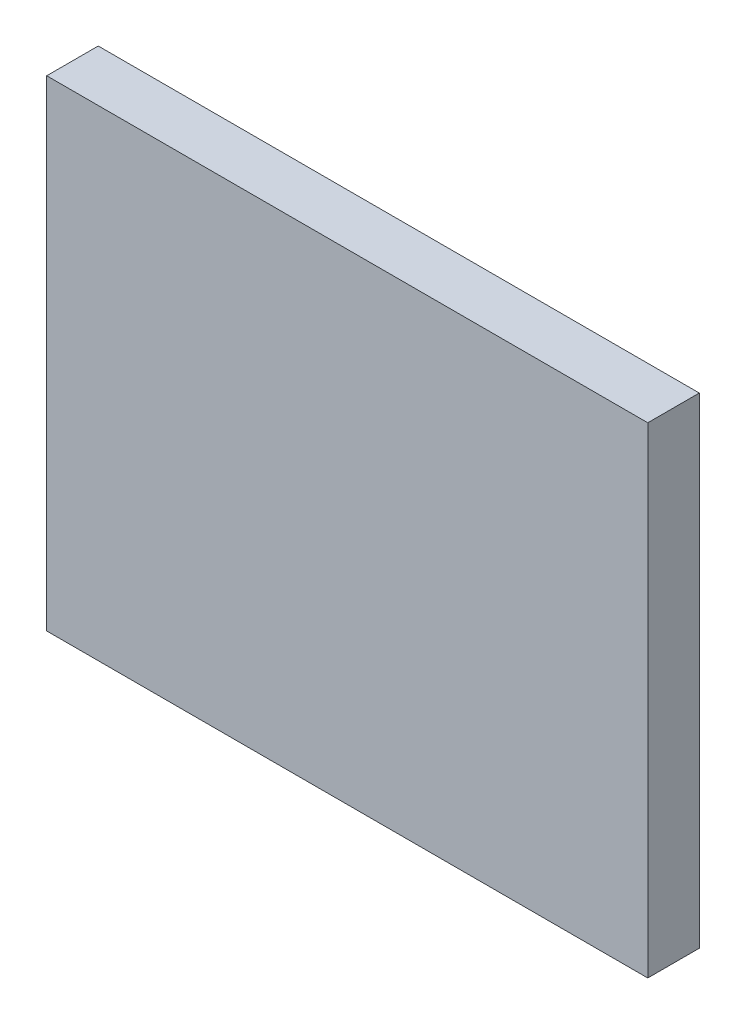
ISO-10303-21;
HEADER;
FILE_DESCRIPTION(('STEP AP214'),'2;1');
FILE_NAME('part.step','',(''),(''),'','','');
FILE_SCHEMA(('AUTOMOTIVE_DESIGN { 1 0 10303 214 1 1 1 1 }'));
ENDSEC;
DATA;
#1=APPLICATION_CONTEXT('core data for automotive mechanical design processes');
#2=APPLICATION_PROTOCOL_DEFINITION('international standard','automotive_design',2000,#1);
#3=PRODUCT_CONTEXT('',#1,'mechanical');
#4=PRODUCT('Part','Part','',(#3));
#5=PRODUCT_RELATED_PRODUCT_CATEGORY('part','',(#4));
#6=PRODUCT_DEFINITION_FORMATION('','',#4);
#7=PRODUCT_DEFINITION_CONTEXT('part definition',#1,'design');
#8=PRODUCT_DEFINITION('design','',#6,#7);
#9=PRODUCT_DEFINITION_SHAPE('','',#8);
#10=(LENGTH_UNIT() NAMED_UNIT(*) SI_UNIT(.MILLI.,.METRE.));
#11=(NAMED_UNIT(*) PLANE_ANGLE_UNIT() SI_UNIT($,.RADIAN.));
#12=(NAMED_UNIT(*) SI_UNIT($,.STERADIAN.) SOLID_ANGLE_UNIT());
#13=UNCERTAINTY_MEASURE_WITH_UNIT(LENGTH_MEASURE(1.E-05),#10,'distance_accuracy_value','');
#14=(GEOMETRIC_REPRESENTATION_CONTEXT(3) GLOBAL_UNCERTAINTY_ASSIGNED_CONTEXT((#13)) GLOBAL_UNIT_ASSIGNED_CONTEXT((#10,
#11,#12)) REPRESENTATION_CONTEXT('',''));
#15=CARTESIAN_POINT('',(0.,0.,0.));
#16=DIRECTION('',(0.,0.,1.));
#17=DIRECTION('',(1.,0.,0.));
#18=AXIS2_PLACEMENT_3D('',#15,#16,#17);
#19=CARTESIAN_POINT('',(0.,0.,30.));
#20=DIRECTION('',(1.,0.,0.));
#21=DIRECTION('',(0.,0.,-1.));
#22=AXIS2_PLACEMENT_3D('',#19,#20,#21);
#23=PLANE('',#22);
#24=DIRECTION('',(0.,-1.,0.));
#25=VECTOR('',#24,1.);
#26=CARTESIAN_POINT('',(0.,0.,0.));
#27=LINE('',#26,#25);
#28=CARTESIAN_POINT('',(0.,280.,0.));
#29=VERTEX_POINT('',#28);
#30=CARTESIAN_POINT('',(0.,0.,0.));
#31=VERTEX_POINT('',#30);
#32=EDGE_CURVE('E96',#29,#31,#27,.T.);
#33=ORIENTED_EDGE('',*,*,#32,.T.);
#34=DIRECTION('',(0.,0.,-1.));
#35=VECTOR('',#34,1.);
#36=CARTESIAN_POINT('',(0.,0.,30.));
#37=LINE('',#36,#35);
#38=CARTESIAN_POINT('',(0.,0.,30.));
#39=VERTEX_POINT('',#38);
#40=EDGE_CURVE('E11',#39,#31,#37,.T.);
#41=ORIENTED_EDGE('',*,*,#40,.F.);
#42=DIRECTION('',(0.,-1.,0.));
#43=VECTOR('',#42,1.);
#44=CARTESIAN_POINT('',(0.,0.,30.));
#45=LINE('',#44,#43);
#46=CARTESIAN_POINT('',(0.,280.,30.));
#47=VERTEX_POINT('',#46);
#48=EDGE_CURVE('E84',#47,#39,#45,.T.);
#49=ORIENTED_EDGE('',*,*,#48,.F.);
#50=DIRECTION('',(0.,0.,-1.));
#51=VECTOR('',#50,1.);
#52=CARTESIAN_POINT('',(0.,280.,30.));
#53=LINE('',#52,#51);
#54=EDGE_CURVE('E92',#47,#29,#53,.T.);
#55=ORIENTED_EDGE('',*,*,#54,.T.);
#56=EDGE_LOOP('',(#33,#41,#49,#55));
#57=FACE_BOUND('',#56,.T.);
#58=ADVANCED_FACE('F33',(#57),#23,.F.);
#59=CARTESIAN_POINT('',(0.,0.,30.));
#60=DIRECTION('',(0.,1.,0.));
#61=DIRECTION('',(0.,0.,1.));
#62=AXIS2_PLACEMENT_3D('',#59,#60,#61);
#63=PLANE('',#62);
#64=DIRECTION('',(1.,0.,0.));
#65=VECTOR('',#64,1.);
#66=CARTESIAN_POINT('',(0.,0.,0.));
#67=LINE('',#66,#65);
#68=CARTESIAN_POINT('',(350.,0.,0.));
#69=VERTEX_POINT('',#68);
#70=EDGE_CURVE('E88',#31,#69,#67,.T.);
#71=ORIENTED_EDGE('',*,*,#70,.T.);
#72=DIRECTION('',(0.,0.,-1.));
#73=VECTOR('',#72,1.);
#74=CARTESIAN_POINT('',(350.,0.,30.));
#75=LINE('',#74,#73);
#76=CARTESIAN_POINT('',(350.,0.,30.));
#77=VERTEX_POINT('',#76);
#78=EDGE_CURVE('E41',#77,#69,#75,.T.);
#79=ORIENTED_EDGE('',*,*,#78,.F.);
#80=DIRECTION('',(1.,0.,0.));
#81=VECTOR('',#80,1.);
#82=CARTESIAN_POINT('',(0.,0.,30.));
#83=LINE('',#82,#81);
#84=EDGE_CURVE('E79',#39,#77,#83,.T.);
#85=ORIENTED_EDGE('',*,*,#84,.F.);
#86=ORIENTED_EDGE('',*,*,#40,.T.);
#87=EDGE_LOOP('',(#71,#79,#85,#86));
#88=FACE_BOUND('',#87,.T.);
#89=ADVANCED_FACE('F87',(#88),#63,.F.);
#90=CARTESIAN_POINT('',(350.,0.,30.));
#91=DIRECTION('',(-1.,0.,0.));
#92=DIRECTION('',(0.,0.,1.));
#93=AXIS2_PLACEMENT_3D('',#90,#91,#92);
#94=PLANE('',#93);
#95=DIRECTION('',(0.,1.,0.));
#96=VECTOR('',#95,1.);
#97=CARTESIAN_POINT('',(350.,0.,0.));
#98=LINE('',#97,#96);
#99=CARTESIAN_POINT('',(350.,280.,0.));
#100=VERTEX_POINT('',#99);
#101=EDGE_CURVE('E66',#69,#100,#98,.T.);
#102=ORIENTED_EDGE('',*,*,#101,.T.);
#103=DIRECTION('',(0.,0.,-1.));
#104=VECTOR('',#103,1.);
#105=CARTESIAN_POINT('',(350.,280.,30.));
#106=LINE('',#105,#104);
#107=CARTESIAN_POINT('',(350.,280.,30.));
#108=VERTEX_POINT('',#107);
#109=EDGE_CURVE('E89',#108,#100,#106,.T.);
#110=ORIENTED_EDGE('',*,*,#109,.F.);
#111=DIRECTION('',(0.,1.,0.));
#112=VECTOR('',#111,1.);
#113=CARTESIAN_POINT('',(350.,0.,30.));
#114=LINE('',#113,#112);
#115=EDGE_CURVE('E82',#77,#108,#114,.T.);
#116=ORIENTED_EDGE('',*,*,#115,.F.);
#117=ORIENTED_EDGE('',*,*,#78,.T.);
#118=EDGE_LOOP('',(#102,#110,#116,#117));
#119=FACE_BOUND('',#118,.T.);
#120=ADVANCED_FACE('F90',(#119),#94,.F.);
#121=CARTESIAN_POINT('',(0.,280.,30.));
#122=DIRECTION('',(0.,-1.,0.));
#123=DIRECTION('',(0.,0.,-1.));
#124=AXIS2_PLACEMENT_3D('',#121,#122,#123);
#125=PLANE('',#124);
#126=DIRECTION('',(-1.,0.,0.));
#127=VECTOR('',#126,1.);
#128=CARTESIAN_POINT('',(0.,280.,0.));
#129=LINE('',#128,#127);
#130=EDGE_CURVE('E72',#100,#29,#129,.T.);
#131=ORIENTED_EDGE('',*,*,#130,.T.);
#132=ORIENTED_EDGE('',*,*,#54,.F.);
#133=DIRECTION('',(-1.,0.,0.));
#134=VECTOR('',#133,1.);
#135=CARTESIAN_POINT('',(0.,280.,30.));
#136=LINE('',#135,#134);
#137=EDGE_CURVE('E49',#108,#47,#136,.T.);
#138=ORIENTED_EDGE('',*,*,#137,.F.);
#139=ORIENTED_EDGE('',*,*,#109,.T.);
#140=EDGE_LOOP('',(#131,#132,#138,#139));
#141=FACE_BOUND('',#140,.T.);
#142=ADVANCED_FACE('F103',(#141),#125,.F.);
#143=CARTESIAN_POINT('',(0.,0.,30.));
#144=DIRECTION('',(0.,0.,-1.));
#145=DIRECTION('',(-1.,0.,0.));
#146=AXIS2_PLACEMENT_3D('',#143,#144,#145);
#147=PLANE('',#146);
#148=ORIENTED_EDGE('',*,*,#48,.T.);
#149=ORIENTED_EDGE('',*,*,#84,.T.);
#150=ORIENTED_EDGE('',*,*,#115,.T.);
#151=ORIENTED_EDGE('',*,*,#137,.T.);
#152=EDGE_LOOP('',(#148,#149,#150,#151));
#153=FACE_BOUND('',#152,.T.);
#154=ADVANCED_FACE('F80',(#153),#147,.F.);
#155=CARTESIAN_POINT('',(0.,0.,0.));
#156=DIRECTION('',(0.,0.,-1.));
#157=DIRECTION('',(-1.,0.,0.));
#158=AXIS2_PLACEMENT_3D('',#155,#156,#157);
#159=PLANE('',#158);
#160=ORIENTED_EDGE('',*,*,#32,.F.);
#161=ORIENTED_EDGE('',*,*,#130,.F.);
#162=ORIENTED_EDGE('',*,*,#101,.F.);
#163=ORIENTED_EDGE('',*,*,#70,.F.);
#164=EDGE_LOOP('',(#160,#161,#162,#163));
#165=FACE_BOUND('',#164,.T.);
#166=ADVANCED_FACE('F106',(#165),#159,.T.);
#167=CLOSED_SHELL('',(#58,#89,#120,#142,#154,#166));
#168=MANIFOLD_SOLID_BREP('B2',#167);
#169=ADVANCED_BREP_SHAPE_REPRESENTATION('',(#18,#168),#14);
#170=SHAPE_DEFINITION_REPRESENTATION(#9,#169);
ENDSEC;
END-ISO-10303-21;
